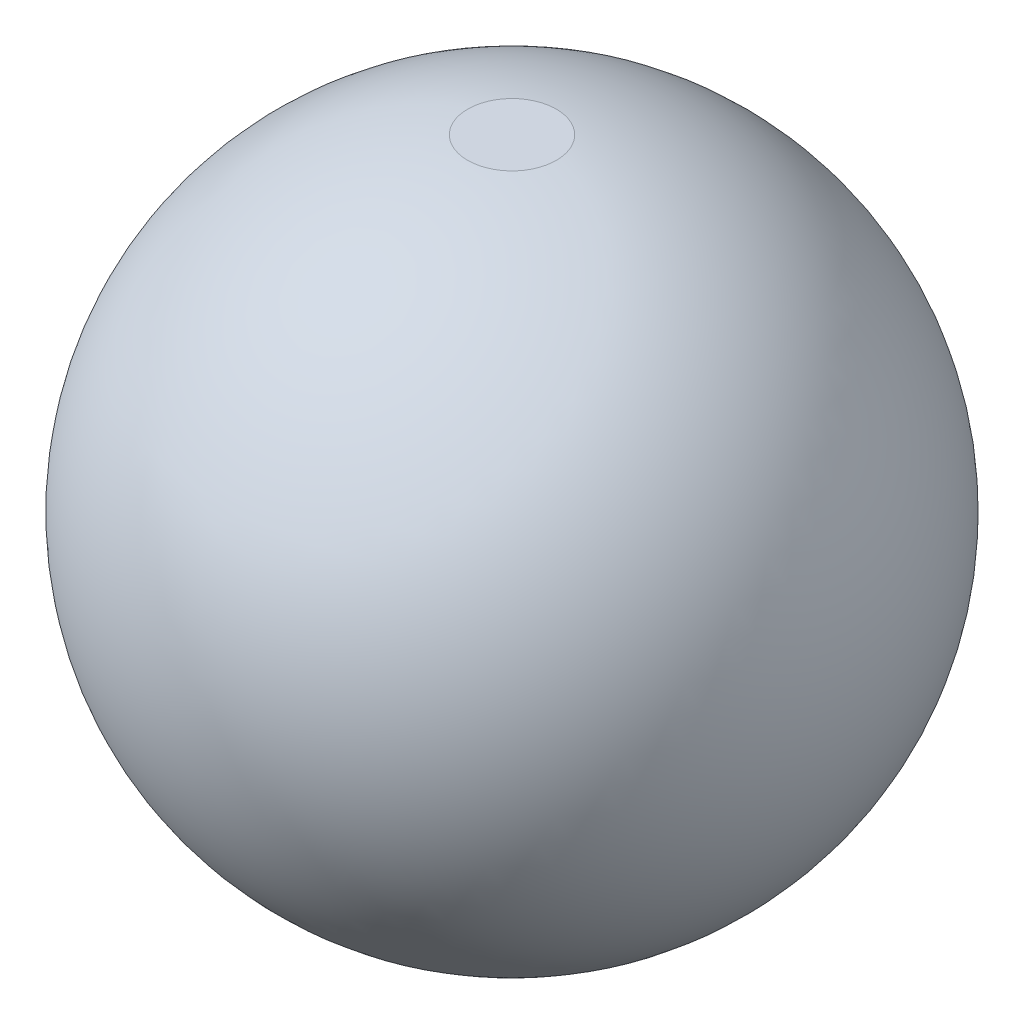
ISO-10303-21;
HEADER;
FILE_DESCRIPTION(('STEP AP214'),'2;1');
FILE_NAME('part.step','',(''),(''),'','','');
FILE_SCHEMA(('AUTOMOTIVE_DESIGN { 1 0 10303 214 1 1 1 1 }'));
ENDSEC;
DATA;
#1=APPLICATION_CONTEXT('core data for automotive mechanical design processes');
#2=APPLICATION_PROTOCOL_DEFINITION('international standard','automotive_design',2000,#1);
#3=PRODUCT_CONTEXT('',#1,'mechanical');
#4=PRODUCT('Part','Part','',(#3));
#5=PRODUCT_RELATED_PRODUCT_CATEGORY('part','',(#4));
#6=PRODUCT_DEFINITION_FORMATION('','',#4);
#7=PRODUCT_DEFINITION_CONTEXT('part definition',#1,'design');
#8=PRODUCT_DEFINITION('design','',#6,#7);
#9=PRODUCT_DEFINITION_SHAPE('','',#8);
#10=(LENGTH_UNIT() NAMED_UNIT(*) SI_UNIT(.MILLI.,.METRE.));
#11=(NAMED_UNIT(*) PLANE_ANGLE_UNIT() SI_UNIT($,.RADIAN.));
#12=(NAMED_UNIT(*) SI_UNIT($,.STERADIAN.) SOLID_ANGLE_UNIT());
#13=UNCERTAINTY_MEASURE_WITH_UNIT(LENGTH_MEASURE(1.E-05),#10,'distance_accuracy_value','');
#14=(GEOMETRIC_REPRESENTATION_CONTEXT(3) GLOBAL_UNCERTAINTY_ASSIGNED_CONTEXT((#13)) GLOBAL_UNIT_ASSIGNED_CONTEXT((#10,
#11,#12)) REPRESENTATION_CONTEXT('',''));
#15=CARTESIAN_POINT('',(0.,0.,0.));
#16=DIRECTION('',(0.,0.,1.));
#17=DIRECTION('',(1.,0.,0.));
#18=AXIS2_PLACEMENT_3D('',#15,#16,#17);
#19=CARTESIAN_POINT('',(0.,0.,0.));
#20=DIRECTION('',(0.,0.,-1.));
#21=DIRECTION('',(1.,0.,0.));
#22=AXIS2_PLACEMENT_3D('',#19,#20,#21);
#23=SPHERICAL_SURFACE('',#22,1.1);
#24=CARTESIAN_POINT('',(0.,0.,0.));
#25=DIRECTION('',(0.,1.,0.));
#26=DIRECTION('',(0.,0.,1.));
#27=AXIS2_PLACEMENT_3D('',#24,#25,#26);
#28=SPHERICAL_SURFACE('',#27,1.1);
#29=CARTESIAN_POINT('',(0.,1.09,0.));
#30=DIRECTION('',(0.,1.,0.));
#31=DIRECTION('',(0.,0.,1.));
#32=AXIS2_PLACEMENT_3D('',#29,#30,#31);
#33=CIRCLE('',#32,0.147986485869487);
#34=CARTESIAN_POINT('',(0.,1.09,0.147986485869487));
#35=VERTEX_POINT('',#34);
#36=EDGE_CURVE('E11',#35,#35,#33,.F.);
#37=ORIENTED_EDGE('',*,*,#36,.T.);
#38=EDGE_LOOP('',(#37));
#39=FACE_BOUND('',#38,.T.);
#40=ADVANCED_FACE('F39',(#39),#28,.T.);
#41=CARTESIAN_POINT('',(0.,1.09,0.));
#42=DIRECTION('',(0.,1.,0.));
#43=DIRECTION('',(0.,0.,1.));
#44=AXIS2_PLACEMENT_3D('',#41,#42,#43);
#45=PLANE('',#44);
#46=ORIENTED_EDGE('',*,*,#36,.F.);
#47=EDGE_LOOP('',(#46));
#48=FACE_BOUND('',#47,.T.);
#49=ADVANCED_FACE('F47',(#48),#45,.T.);
#50=CLOSED_SHELL('',(#40,#49));
#51=MANIFOLD_SOLID_BREP('B2',#50);
#52=ADVANCED_BREP_SHAPE_REPRESENTATION('',(#18,#51),#14);
#53=SHAPE_DEFINITION_REPRESENTATION(#9,#52);
ENDSEC;
END-ISO-10303-21;
